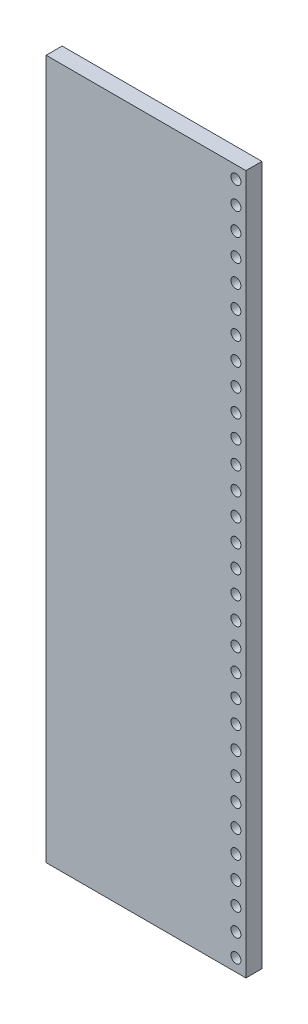
ISO-10303-21;
HEADER;
FILE_DESCRIPTION(('STEP AP214'),'2;1');
FILE_NAME('part.step','',(''),(''),'','','');
FILE_SCHEMA(('AUTOMOTIVE_DESIGN { 1 0 10303 214 1 1 1 1 }'));
ENDSEC;
DATA;
#1=APPLICATION_CONTEXT('core data for automotive mechanical design processes');
#2=APPLICATION_PROTOCOL_DEFINITION('international standard','automotive_design',2000,#1);
#3=PRODUCT_CONTEXT('',#1,'mechanical');
#4=PRODUCT('Part','Part','',(#3));
#5=PRODUCT_RELATED_PRODUCT_CATEGORY('part','',(#4));
#6=PRODUCT_DEFINITION_FORMATION('','',#4);
#7=PRODUCT_DEFINITION_CONTEXT('part definition',#1,'design');
#8=PRODUCT_DEFINITION('design','',#6,#7);
#9=PRODUCT_DEFINITION_SHAPE('','',#8);
#10=(LENGTH_UNIT() NAMED_UNIT(*) SI_UNIT(.MILLI.,.METRE.));
#11=(NAMED_UNIT(*) PLANE_ANGLE_UNIT() SI_UNIT($,.RADIAN.));
#12=(NAMED_UNIT(*) SI_UNIT($,.STERADIAN.) SOLID_ANGLE_UNIT());
#13=UNCERTAINTY_MEASURE_WITH_UNIT(LENGTH_MEASURE(1.E-05),#10,'distance_accuracy_value','');
#14=(GEOMETRIC_REPRESENTATION_CONTEXT(3) GLOBAL_UNCERTAINTY_ASSIGNED_CONTEXT((#13)) GLOBAL_UNIT_ASSIGNED_CONTEXT((#10,
#11,#12)) REPRESENTATION_CONTEXT('',''));
#15=CARTESIAN_POINT('',(0.,0.,0.));
#16=DIRECTION('',(0.,0.,1.));
#17=DIRECTION('',(1.,0.,0.));
#18=AXIS2_PLACEMENT_3D('',#15,#16,#17);
#19=CARTESIAN_POINT('',(90.,687.5,0.));
#20=DIRECTION('',(0.,0.,1.));
#21=DIRECTION('',(1.,0.,0.));
#22=AXIS2_PLACEMENT_3D('',#19,#20,#21);
#23=CYLINDRICAL_SURFACE('',#22,5.);
#24=CARTESIAN_POINT('',(90.,687.5,0.));
#25=DIRECTION('',(0.,0.,-1.));
#26=DIRECTION('',(-1.,0.,0.));
#27=AXIS2_PLACEMENT_3D('',#24,#25,#26);
#28=CIRCLE('',#27,5.);
#29=CARTESIAN_POINT('',(85.,687.5,0.));
#30=VERTEX_POINT('',#29);
#31=EDGE_CURVE('E49',#30,#30,#28,.T.);
#32=ORIENTED_EDGE('',*,*,#31,.T.);
#33=EDGE_LOOP('',(#32));
#34=FACE_BOUND('',#33,.T.);
#35=CARTESIAN_POINT('',(90.,687.5,16.));
#36=DIRECTION('',(0.,0.,-1.));
#37=DIRECTION('',(-1.,0.,0.));
#38=AXIS2_PLACEMENT_3D('',#35,#36,#37);
#39=CIRCLE('',#38,5.);
#40=CARTESIAN_POINT('',(85.,687.5,16.));
#41=VERTEX_POINT('',#40);
#42=EDGE_CURVE('E11',#41,#41,#39,.T.);
#43=ORIENTED_EDGE('',*,*,#42,.F.);
#44=EDGE_LOOP('',(#43));
#45=FACE_BOUND('',#44,.T.);
#46=ADVANCED_FACE('F41',(#34,#45),#23,.F.);
#47=CARTESIAN_POINT('',(90.,665.,0.));
#48=DIRECTION('',(0.,0.,1.));
#49=DIRECTION('',(1.,0.,0.));
#50=AXIS2_PLACEMENT_3D('',#47,#48,#49);
#51=CYLINDRICAL_SURFACE('',#50,5.);
#52=CARTESIAN_POINT('',(90.,665.,0.));
#53=DIRECTION('',(0.,0.,-1.));
#54=DIRECTION('',(-1.,0.,0.));
#55=AXIS2_PLACEMENT_3D('',#52,#53,#54);
#56=CIRCLE('',#55,5.);
#57=CARTESIAN_POINT('',(85.,665.,0.));
#58=VERTEX_POINT('',#57);
#59=EDGE_CURVE('E284',#58,#58,#56,.T.);
#60=ORIENTED_EDGE('',*,*,#59,.T.);
#61=EDGE_LOOP('',(#60));
#62=FACE_BOUND('',#61,.T.);
#63=CARTESIAN_POINT('',(90.,665.,16.));
#64=DIRECTION('',(0.,0.,-1.));
#65=DIRECTION('',(-1.,0.,0.));
#66=AXIS2_PLACEMENT_3D('',#63,#64,#65);
#67=CIRCLE('',#66,5.);
#68=CARTESIAN_POINT('',(85.,665.,16.));
#69=VERTEX_POINT('',#68);
#70=EDGE_CURVE('E287',#69,#69,#67,.T.);
#71=ORIENTED_EDGE('',*,*,#70,.F.);
#72=EDGE_LOOP('',(#71));
#73=FACE_BOUND('',#72,.T.);
#74=ADVANCED_FACE('F313',(#62,#73),#51,.F.);
#75=CARTESIAN_POINT('',(90.,642.5,0.));
#76=DIRECTION('',(0.,0.,1.));
#77=DIRECTION('',(1.,0.,0.));
#78=AXIS2_PLACEMENT_3D('',#75,#76,#77);
#79=CYLINDRICAL_SURFACE('',#78,5.);
#80=CARTESIAN_POINT('',(90.,642.5,0.));
#81=DIRECTION('',(0.,0.,-1.));
#82=DIRECTION('',(-1.,0.,0.));
#83=AXIS2_PLACEMENT_3D('',#80,#81,#82);
#84=CIRCLE('',#83,5.);
#85=CARTESIAN_POINT('',(85.,642.5,0.));
#86=VERTEX_POINT('',#85);
#87=EDGE_CURVE('E278',#86,#86,#84,.T.);
#88=ORIENTED_EDGE('',*,*,#87,.T.);
#89=EDGE_LOOP('',(#88));
#90=FACE_BOUND('',#89,.T.);
#91=CARTESIAN_POINT('',(90.,642.5,16.));
#92=DIRECTION('',(0.,0.,-1.));
#93=DIRECTION('',(-1.,0.,0.));
#94=AXIS2_PLACEMENT_3D('',#91,#92,#93);
#95=CIRCLE('',#94,5.);
#96=CARTESIAN_POINT('',(85.,642.5,16.));
#97=VERTEX_POINT('',#96);
#98=EDGE_CURVE('E281',#97,#97,#95,.T.);
#99=ORIENTED_EDGE('',*,*,#98,.F.);
#100=EDGE_LOOP('',(#99));
#101=FACE_BOUND('',#100,.T.);
#102=ADVANCED_FACE('F318',(#90,#101),#79,.F.);
#103=CARTESIAN_POINT('',(90.,620.,0.));
#104=DIRECTION('',(0.,0.,1.));
#105=DIRECTION('',(1.,0.,0.));
#106=AXIS2_PLACEMENT_3D('',#103,#104,#105);
#107=CYLINDRICAL_SURFACE('',#106,5.);
#108=CARTESIAN_POINT('',(90.,620.,0.));
#109=DIRECTION('',(0.,0.,-1.));
#110=DIRECTION('',(-1.,0.,0.));
#111=AXIS2_PLACEMENT_3D('',#108,#109,#110);
#112=CIRCLE('',#111,5.);
#113=CARTESIAN_POINT('',(85.,620.,0.));
#114=VERTEX_POINT('',#113);
#115=EDGE_CURVE('E272',#114,#114,#112,.T.);
#116=ORIENTED_EDGE('',*,*,#115,.T.);
#117=EDGE_LOOP('',(#116));
#118=FACE_BOUND('',#117,.T.);
#119=CARTESIAN_POINT('',(90.,620.,16.));
#120=DIRECTION('',(0.,0.,-1.));
#121=DIRECTION('',(-1.,0.,0.));
#122=AXIS2_PLACEMENT_3D('',#119,#120,#121);
#123=CIRCLE('',#122,5.);
#124=CARTESIAN_POINT('',(85.,620.,16.));
#125=VERTEX_POINT('',#124);
#126=EDGE_CURVE('E275',#125,#125,#123,.T.);
#127=ORIENTED_EDGE('',*,*,#126,.F.);
#128=EDGE_LOOP('',(#127));
#129=FACE_BOUND('',#128,.T.);
#130=ADVANCED_FACE('F323',(#118,#129),#107,.F.);
#131=CARTESIAN_POINT('',(90.,597.5,0.));
#132=DIRECTION('',(0.,0.,1.));
#133=DIRECTION('',(1.,0.,0.));
#134=AXIS2_PLACEMENT_3D('',#131,#132,#133);
#135=CYLINDRICAL_SURFACE('',#134,5.);
#136=CARTESIAN_POINT('',(90.,597.5,0.));
#137=DIRECTION('',(0.,0.,-1.));
#138=DIRECTION('',(-1.,0.,0.));
#139=AXIS2_PLACEMENT_3D('',#136,#137,#138);
#140=CIRCLE('',#139,5.);
#141=CARTESIAN_POINT('',(85.,597.5,0.));
#142=VERTEX_POINT('',#141);
#143=EDGE_CURVE('E266',#142,#142,#140,.T.);
#144=ORIENTED_EDGE('',*,*,#143,.T.);
#145=EDGE_LOOP('',(#144));
#146=FACE_BOUND('',#145,.T.);
#147=CARTESIAN_POINT('',(90.,597.5,16.));
#148=DIRECTION('',(0.,0.,-1.));
#149=DIRECTION('',(-1.,0.,0.));
#150=AXIS2_PLACEMENT_3D('',#147,#148,#149);
#151=CIRCLE('',#150,5.);
#152=CARTESIAN_POINT('',(85.,597.5,16.));
#153=VERTEX_POINT('',#152);
#154=EDGE_CURVE('E269',#153,#153,#151,.T.);
#155=ORIENTED_EDGE('',*,*,#154,.F.);
#156=EDGE_LOOP('',(#155));
#157=FACE_BOUND('',#156,.T.);
#158=ADVANCED_FACE('F330',(#146,#157),#135,.F.);
#159=CARTESIAN_POINT('',(90.,575.,0.));
#160=DIRECTION('',(0.,0.,1.));
#161=DIRECTION('',(1.,0.,0.));
#162=AXIS2_PLACEMENT_3D('',#159,#160,#161);
#163=CYLINDRICAL_SURFACE('',#162,5.);
#164=CARTESIAN_POINT('',(90.,575.,0.));
#165=DIRECTION('',(0.,0.,-1.));
#166=DIRECTION('',(-1.,0.,0.));
#167=AXIS2_PLACEMENT_3D('',#164,#165,#166);
#168=CIRCLE('',#167,5.);
#169=CARTESIAN_POINT('',(85.,575.,0.));
#170=VERTEX_POINT('',#169);
#171=EDGE_CURVE('E260',#170,#170,#168,.T.);
#172=ORIENTED_EDGE('',*,*,#171,.T.);
#173=EDGE_LOOP('',(#172));
#174=FACE_BOUND('',#173,.T.);
#175=CARTESIAN_POINT('',(90.,575.,16.));
#176=DIRECTION('',(0.,0.,-1.));
#177=DIRECTION('',(-1.,0.,0.));
#178=AXIS2_PLACEMENT_3D('',#175,#176,#177);
#179=CIRCLE('',#178,5.);
#180=CARTESIAN_POINT('',(85.,575.,16.));
#181=VERTEX_POINT('',#180);
#182=EDGE_CURVE('E263',#181,#181,#179,.T.);
#183=ORIENTED_EDGE('',*,*,#182,.F.);
#184=EDGE_LOOP('',(#183));
#185=FACE_BOUND('',#184,.T.);
#186=ADVANCED_FACE('F334',(#174,#185),#163,.F.);
#187=CARTESIAN_POINT('',(90.,552.5,0.));
#188=DIRECTION('',(0.,0.,1.));
#189=DIRECTION('',(1.,0.,0.));
#190=AXIS2_PLACEMENT_3D('',#187,#188,#189);
#191=CYLINDRICAL_SURFACE('',#190,5.);
#192=CARTESIAN_POINT('',(90.,552.5,0.));
#193=DIRECTION('',(0.,0.,-1.));
#194=DIRECTION('',(-1.,0.,0.));
#195=AXIS2_PLACEMENT_3D('',#192,#193,#194);
#196=CIRCLE('',#195,5.);
#197=CARTESIAN_POINT('',(85.,552.5,0.));
#198=VERTEX_POINT('',#197);
#199=EDGE_CURVE('E254',#198,#198,#196,.T.);
#200=ORIENTED_EDGE('',*,*,#199,.T.);
#201=EDGE_LOOP('',(#200));
#202=FACE_BOUND('',#201,.T.);
#203=CARTESIAN_POINT('',(90.,552.5,16.));
#204=DIRECTION('',(0.,0.,-1.));
#205=DIRECTION('',(-1.,0.,0.));
#206=AXIS2_PLACEMENT_3D('',#203,#204,#205);
#207=CIRCLE('',#206,5.);
#208=CARTESIAN_POINT('',(85.,552.5,16.));
#209=VERTEX_POINT('',#208);
#210=EDGE_CURVE('E257',#209,#209,#207,.T.);
#211=ORIENTED_EDGE('',*,*,#210,.F.);
#212=EDGE_LOOP('',(#211));
#213=FACE_BOUND('',#212,.T.);
#214=ADVANCED_FACE('F338',(#202,#213),#191,.F.);
#215=CARTESIAN_POINT('',(90.,530.,0.));
#216=DIRECTION('',(0.,0.,1.));
#217=DIRECTION('',(1.,0.,0.));
#218=AXIS2_PLACEMENT_3D('',#215,#216,#217);
#219=CYLINDRICAL_SURFACE('',#218,5.);
#220=CARTESIAN_POINT('',(90.,530.,0.));
#221=DIRECTION('',(0.,0.,-1.));
#222=DIRECTION('',(-1.,0.,0.));
#223=AXIS2_PLACEMENT_3D('',#220,#221,#222);
#224=CIRCLE('',#223,5.);
#225=CARTESIAN_POINT('',(85.,530.,0.));
#226=VERTEX_POINT('',#225);
#227=EDGE_CURVE('E248',#226,#226,#224,.T.);
#228=ORIENTED_EDGE('',*,*,#227,.T.);
#229=EDGE_LOOP('',(#228));
#230=FACE_BOUND('',#229,.T.);
#231=CARTESIAN_POINT('',(90.,530.,16.));
#232=DIRECTION('',(0.,0.,-1.));
#233=DIRECTION('',(-1.,0.,0.));
#234=AXIS2_PLACEMENT_3D('',#231,#232,#233);
#235=CIRCLE('',#234,5.);
#236=CARTESIAN_POINT('',(85.,530.,16.));
#237=VERTEX_POINT('',#236);
#238=EDGE_CURVE('E251',#237,#237,#235,.T.);
#239=ORIENTED_EDGE('',*,*,#238,.F.);
#240=EDGE_LOOP('',(#239));
#241=FACE_BOUND('',#240,.T.);
#242=ADVANCED_FACE('F342',(#230,#241),#219,.F.);
#243=CARTESIAN_POINT('',(90.,507.5,0.));
#244=DIRECTION('',(0.,0.,1.));
#245=DIRECTION('',(1.,0.,0.));
#246=AXIS2_PLACEMENT_3D('',#243,#244,#245);
#247=CYLINDRICAL_SURFACE('',#246,5.);
#248=CARTESIAN_POINT('',(90.,507.5,0.));
#249=DIRECTION('',(0.,0.,-1.));
#250=DIRECTION('',(-1.,0.,0.));
#251=AXIS2_PLACEMENT_3D('',#248,#249,#250);
#252=CIRCLE('',#251,5.);
#253=CARTESIAN_POINT('',(85.,507.5,0.));
#254=VERTEX_POINT('',#253);
#255=EDGE_CURVE('E242',#254,#254,#252,.T.);
#256=ORIENTED_EDGE('',*,*,#255,.T.);
#257=EDGE_LOOP('',(#256));
#258=FACE_BOUND('',#257,.T.);
#259=CARTESIAN_POINT('',(90.,507.5,16.));
#260=DIRECTION('',(0.,0.,-1.));
#261=DIRECTION('',(-1.,0.,0.));
#262=AXIS2_PLACEMENT_3D('',#259,#260,#261);
#263=CIRCLE('',#262,5.);
#264=CARTESIAN_POINT('',(85.,507.5,16.));
#265=VERTEX_POINT('',#264);
#266=EDGE_CURVE('E245',#265,#265,#263,.T.);
#267=ORIENTED_EDGE('',*,*,#266,.F.);
#268=EDGE_LOOP('',(#267));
#269=FACE_BOUND('',#268,.T.);
#270=ADVANCED_FACE('F346',(#258,#269),#247,.F.);
#271=CARTESIAN_POINT('',(90.,485.,0.));
#272=DIRECTION('',(0.,0.,1.));
#273=DIRECTION('',(1.,0.,0.));
#274=AXIS2_PLACEMENT_3D('',#271,#272,#273);
#275=CYLINDRICAL_SURFACE('',#274,5.);
#276=CARTESIAN_POINT('',(90.,485.,0.));
#277=DIRECTION('',(0.,0.,-1.));
#278=DIRECTION('',(-1.,0.,0.));
#279=AXIS2_PLACEMENT_3D('',#276,#277,#278);
#280=CIRCLE('',#279,5.);
#281=CARTESIAN_POINT('',(85.,485.,0.));
#282=VERTEX_POINT('',#281);
#283=EDGE_CURVE('E236',#282,#282,#280,.T.);
#284=ORIENTED_EDGE('',*,*,#283,.T.);
#285=EDGE_LOOP('',(#284));
#286=FACE_BOUND('',#285,.T.);
#287=CARTESIAN_POINT('',(90.,485.,16.));
#288=DIRECTION('',(0.,0.,-1.));
#289=DIRECTION('',(-1.,0.,0.));
#290=AXIS2_PLACEMENT_3D('',#287,#288,#289);
#291=CIRCLE('',#290,5.);
#292=CARTESIAN_POINT('',(85.,485.,16.));
#293=VERTEX_POINT('',#292);
#294=EDGE_CURVE('E239',#293,#293,#291,.T.);
#295=ORIENTED_EDGE('',*,*,#294,.F.);
#296=EDGE_LOOP('',(#295));
#297=FACE_BOUND('',#296,.T.);
#298=ADVANCED_FACE('F350',(#286,#297),#275,.F.);
#299=CARTESIAN_POINT('',(90.,462.5,0.));
#300=DIRECTION('',(0.,0.,1.));
#301=DIRECTION('',(1.,0.,0.));
#302=AXIS2_PLACEMENT_3D('',#299,#300,#301);
#303=CYLINDRICAL_SURFACE('',#302,5.);
#304=CARTESIAN_POINT('',(90.,462.5,0.));
#305=DIRECTION('',(0.,0.,-1.));
#306=DIRECTION('',(-1.,0.,0.));
#307=AXIS2_PLACEMENT_3D('',#304,#305,#306);
#308=CIRCLE('',#307,5.);
#309=CARTESIAN_POINT('',(85.,462.5,0.));
#310=VERTEX_POINT('',#309);
#311=EDGE_CURVE('E230',#310,#310,#308,.T.);
#312=ORIENTED_EDGE('',*,*,#311,.T.);
#313=EDGE_LOOP('',(#312));
#314=FACE_BOUND('',#313,.T.);
#315=CARTESIAN_POINT('',(90.,462.5,16.));
#316=DIRECTION('',(0.,0.,-1.));
#317=DIRECTION('',(-1.,0.,0.));
#318=AXIS2_PLACEMENT_3D('',#315,#316,#317);
#319=CIRCLE('',#318,5.);
#320=CARTESIAN_POINT('',(85.,462.5,16.));
#321=VERTEX_POINT('',#320);
#322=EDGE_CURVE('E233',#321,#321,#319,.T.);
#323=ORIENTED_EDGE('',*,*,#322,.F.);
#324=EDGE_LOOP('',(#323));
#325=FACE_BOUND('',#324,.T.);
#326=ADVANCED_FACE('F354',(#314,#325),#303,.F.);
#327=CARTESIAN_POINT('',(90.,440.,0.));
#328=DIRECTION('',(0.,0.,1.));
#329=DIRECTION('',(1.,0.,0.));
#330=AXIS2_PLACEMENT_3D('',#327,#328,#329);
#331=CYLINDRICAL_SURFACE('',#330,5.);
#332=CARTESIAN_POINT('',(90.,440.,0.));
#333=DIRECTION('',(0.,0.,-1.));
#334=DIRECTION('',(-1.,0.,0.));
#335=AXIS2_PLACEMENT_3D('',#332,#333,#334);
#336=CIRCLE('',#335,5.);
#337=CARTESIAN_POINT('',(85.,440.,0.));
#338=VERTEX_POINT('',#337);
#339=EDGE_CURVE('E224',#338,#338,#336,.T.);
#340=ORIENTED_EDGE('',*,*,#339,.T.);
#341=EDGE_LOOP('',(#340));
#342=FACE_BOUND('',#341,.T.);
#343=CARTESIAN_POINT('',(90.,440.,16.));
#344=DIRECTION('',(0.,0.,-1.));
#345=DIRECTION('',(-1.,0.,0.));
#346=AXIS2_PLACEMENT_3D('',#343,#344,#345);
#347=CIRCLE('',#346,5.);
#348=CARTESIAN_POINT('',(85.,440.,16.));
#349=VERTEX_POINT('',#348);
#350=EDGE_CURVE('E227',#349,#349,#347,.T.);
#351=ORIENTED_EDGE('',*,*,#350,.F.);
#352=EDGE_LOOP('',(#351));
#353=FACE_BOUND('',#352,.T.);
#354=ADVANCED_FACE('F358',(#342,#353),#331,.F.);
#355=CARTESIAN_POINT('',(90.,417.5,0.));
#356=DIRECTION('',(0.,0.,1.));
#357=DIRECTION('',(1.,0.,0.));
#358=AXIS2_PLACEMENT_3D('',#355,#356,#357);
#359=CYLINDRICAL_SURFACE('',#358,5.);
#360=CARTESIAN_POINT('',(90.,417.5,0.));
#361=DIRECTION('',(0.,0.,-1.));
#362=DIRECTION('',(-1.,0.,0.));
#363=AXIS2_PLACEMENT_3D('',#360,#361,#362);
#364=CIRCLE('',#363,5.);
#365=CARTESIAN_POINT('',(85.,417.5,0.));
#366=VERTEX_POINT('',#365);
#367=EDGE_CURVE('E218',#366,#366,#364,.T.);
#368=ORIENTED_EDGE('',*,*,#367,.T.);
#369=EDGE_LOOP('',(#368));
#370=FACE_BOUND('',#369,.T.);
#371=CARTESIAN_POINT('',(90.,417.5,16.));
#372=DIRECTION('',(0.,0.,-1.));
#373=DIRECTION('',(-1.,0.,0.));
#374=AXIS2_PLACEMENT_3D('',#371,#372,#373);
#375=CIRCLE('',#374,5.);
#376=CARTESIAN_POINT('',(85.,417.5,16.));
#377=VERTEX_POINT('',#376);
#378=EDGE_CURVE('E221',#377,#377,#375,.T.);
#379=ORIENTED_EDGE('',*,*,#378,.F.);
#380=EDGE_LOOP('',(#379));
#381=FACE_BOUND('',#380,.T.);
#382=ADVANCED_FACE('F362',(#370,#381),#359,.F.);
#383=CARTESIAN_POINT('',(90.,395.,0.));
#384=DIRECTION('',(0.,0.,1.));
#385=DIRECTION('',(1.,0.,0.));
#386=AXIS2_PLACEMENT_3D('',#383,#384,#385);
#387=CYLINDRICAL_SURFACE('',#386,5.);
#388=CARTESIAN_POINT('',(90.,395.,0.));
#389=DIRECTION('',(0.,0.,-1.));
#390=DIRECTION('',(-1.,0.,0.));
#391=AXIS2_PLACEMENT_3D('',#388,#389,#390);
#392=CIRCLE('',#391,5.);
#393=CARTESIAN_POINT('',(85.,395.,0.));
#394=VERTEX_POINT('',#393);
#395=EDGE_CURVE('E212',#394,#394,#392,.T.);
#396=ORIENTED_EDGE('',*,*,#395,.T.);
#397=EDGE_LOOP('',(#396));
#398=FACE_BOUND('',#397,.T.);
#399=CARTESIAN_POINT('',(90.,395.,16.));
#400=DIRECTION('',(0.,0.,-1.));
#401=DIRECTION('',(-1.,0.,0.));
#402=AXIS2_PLACEMENT_3D('',#399,#400,#401);
#403=CIRCLE('',#402,5.);
#404=CARTESIAN_POINT('',(85.,395.,16.));
#405=VERTEX_POINT('',#404);
#406=EDGE_CURVE('E215',#405,#405,#403,.T.);
#407=ORIENTED_EDGE('',*,*,#406,.F.);
#408=EDGE_LOOP('',(#407));
#409=FACE_BOUND('',#408,.T.);
#410=ADVANCED_FACE('F366',(#398,#409),#387,.F.);
#411=CARTESIAN_POINT('',(90.,372.5,0.));
#412=DIRECTION('',(0.,0.,1.));
#413=DIRECTION('',(1.,0.,0.));
#414=AXIS2_PLACEMENT_3D('',#411,#412,#413);
#415=CYLINDRICAL_SURFACE('',#414,5.);
#416=CARTESIAN_POINT('',(90.,372.5,0.));
#417=DIRECTION('',(0.,0.,-1.));
#418=DIRECTION('',(-1.,0.,0.));
#419=AXIS2_PLACEMENT_3D('',#416,#417,#418);
#420=CIRCLE('',#419,5.);
#421=CARTESIAN_POINT('',(85.,372.5,0.));
#422=VERTEX_POINT('',#421);
#423=EDGE_CURVE('E206',#422,#422,#420,.T.);
#424=ORIENTED_EDGE('',*,*,#423,.T.);
#425=EDGE_LOOP('',(#424));
#426=FACE_BOUND('',#425,.T.);
#427=CARTESIAN_POINT('',(90.,372.5,16.));
#428=DIRECTION('',(0.,0.,-1.));
#429=DIRECTION('',(-1.,0.,0.));
#430=AXIS2_PLACEMENT_3D('',#427,#428,#429);
#431=CIRCLE('',#430,5.);
#432=CARTESIAN_POINT('',(85.,372.5,16.));
#433=VERTEX_POINT('',#432);
#434=EDGE_CURVE('E209',#433,#433,#431,.T.);
#435=ORIENTED_EDGE('',*,*,#434,.F.);
#436=EDGE_LOOP('',(#435));
#437=FACE_BOUND('',#436,.T.);
#438=ADVANCED_FACE('F370',(#426,#437),#415,.F.);
#439=CARTESIAN_POINT('',(90.,350.,0.));
#440=DIRECTION('',(0.,0.,1.));
#441=DIRECTION('',(1.,0.,0.));
#442=AXIS2_PLACEMENT_3D('',#439,#440,#441);
#443=CYLINDRICAL_SURFACE('',#442,5.);
#444=CARTESIAN_POINT('',(90.,350.,0.));
#445=DIRECTION('',(0.,0.,-1.));
#446=DIRECTION('',(-1.,0.,0.));
#447=AXIS2_PLACEMENT_3D('',#444,#445,#446);
#448=CIRCLE('',#447,5.);
#449=CARTESIAN_POINT('',(85.,350.,0.));
#450=VERTEX_POINT('',#449);
#451=EDGE_CURVE('E200',#450,#450,#448,.T.);
#452=ORIENTED_EDGE('',*,*,#451,.T.);
#453=EDGE_LOOP('',(#452));
#454=FACE_BOUND('',#453,.T.);
#455=CARTESIAN_POINT('',(90.,350.,16.));
#456=DIRECTION('',(0.,0.,-1.));
#457=DIRECTION('',(-1.,0.,0.));
#458=AXIS2_PLACEMENT_3D('',#455,#456,#457);
#459=CIRCLE('',#458,5.);
#460=CARTESIAN_POINT('',(85.,350.,16.));
#461=VERTEX_POINT('',#460);
#462=EDGE_CURVE('E203',#461,#461,#459,.T.);
#463=ORIENTED_EDGE('',*,*,#462,.F.);
#464=EDGE_LOOP('',(#463));
#465=FACE_BOUND('',#464,.T.);
#466=ADVANCED_FACE('F374',(#454,#465),#443,.F.);
#467=CARTESIAN_POINT('',(90.,327.5,0.));
#468=DIRECTION('',(0.,0.,1.));
#469=DIRECTION('',(1.,0.,0.));
#470=AXIS2_PLACEMENT_3D('',#467,#468,#469);
#471=CYLINDRICAL_SURFACE('',#470,5.);
#472=CARTESIAN_POINT('',(90.,327.5,0.));
#473=DIRECTION('',(0.,0.,-1.));
#474=DIRECTION('',(-1.,0.,0.));
#475=AXIS2_PLACEMENT_3D('',#472,#473,#474);
#476=CIRCLE('',#475,5.);
#477=CARTESIAN_POINT('',(85.,327.5,0.));
#478=VERTEX_POINT('',#477);
#479=EDGE_CURVE('E194',#478,#478,#476,.T.);
#480=ORIENTED_EDGE('',*,*,#479,.T.);
#481=EDGE_LOOP('',(#480));
#482=FACE_BOUND('',#481,.T.);
#483=CARTESIAN_POINT('',(90.,327.5,16.));
#484=DIRECTION('',(0.,0.,-1.));
#485=DIRECTION('',(-1.,0.,0.));
#486=AXIS2_PLACEMENT_3D('',#483,#484,#485);
#487=CIRCLE('',#486,5.);
#488=CARTESIAN_POINT('',(85.,327.5,16.));
#489=VERTEX_POINT('',#488);
#490=EDGE_CURVE('E197',#489,#489,#487,.T.);
#491=ORIENTED_EDGE('',*,*,#490,.F.);
#492=EDGE_LOOP('',(#491));
#493=FACE_BOUND('',#492,.T.);
#494=ADVANCED_FACE('F378',(#482,#493),#471,.F.);
#495=CARTESIAN_POINT('',(90.,305.,0.));
#496=DIRECTION('',(0.,0.,1.));
#497=DIRECTION('',(1.,0.,0.));
#498=AXIS2_PLACEMENT_3D('',#495,#496,#497);
#499=CYLINDRICAL_SURFACE('',#498,5.);
#500=CARTESIAN_POINT('',(90.,305.,0.));
#501=DIRECTION('',(0.,0.,-1.));
#502=DIRECTION('',(-1.,0.,0.));
#503=AXIS2_PLACEMENT_3D('',#500,#501,#502);
#504=CIRCLE('',#503,5.);
#505=CARTESIAN_POINT('',(85.,305.,0.));
#506=VERTEX_POINT('',#505);
#507=EDGE_CURVE('E188',#506,#506,#504,.T.);
#508=ORIENTED_EDGE('',*,*,#507,.T.);
#509=EDGE_LOOP('',(#508));
#510=FACE_BOUND('',#509,.T.);
#511=CARTESIAN_POINT('',(90.,305.,16.));
#512=DIRECTION('',(0.,0.,-1.));
#513=DIRECTION('',(-1.,0.,0.));
#514=AXIS2_PLACEMENT_3D('',#511,#512,#513);
#515=CIRCLE('',#514,5.);
#516=CARTESIAN_POINT('',(85.,305.,16.));
#517=VERTEX_POINT('',#516);
#518=EDGE_CURVE('E191',#517,#517,#515,.T.);
#519=ORIENTED_EDGE('',*,*,#518,.F.);
#520=EDGE_LOOP('',(#519));
#521=FACE_BOUND('',#520,.T.);
#522=ADVANCED_FACE('F382',(#510,#521),#499,.F.);
#523=CARTESIAN_POINT('',(90.,282.5,0.));
#524=DIRECTION('',(0.,0.,1.));
#525=DIRECTION('',(1.,0.,0.));
#526=AXIS2_PLACEMENT_3D('',#523,#524,#525);
#527=CYLINDRICAL_SURFACE('',#526,5.);
#528=CARTESIAN_POINT('',(90.,282.5,0.));
#529=DIRECTION('',(0.,0.,-1.));
#530=DIRECTION('',(-1.,0.,0.));
#531=AXIS2_PLACEMENT_3D('',#528,#529,#530);
#532=CIRCLE('',#531,5.);
#533=CARTESIAN_POINT('',(85.,282.5,0.));
#534=VERTEX_POINT('',#533);
#535=EDGE_CURVE('E182',#534,#534,#532,.T.);
#536=ORIENTED_EDGE('',*,*,#535,.T.);
#537=EDGE_LOOP('',(#536));
#538=FACE_BOUND('',#537,.T.);
#539=CARTESIAN_POINT('',(90.,282.5,16.));
#540=DIRECTION('',(0.,0.,-1.));
#541=DIRECTION('',(-1.,0.,0.));
#542=AXIS2_PLACEMENT_3D('',#539,#540,#541);
#543=CIRCLE('',#542,5.);
#544=CARTESIAN_POINT('',(85.,282.5,16.));
#545=VERTEX_POINT('',#544);
#546=EDGE_CURVE('E185',#545,#545,#543,.T.);
#547=ORIENTED_EDGE('',*,*,#546,.F.);
#548=EDGE_LOOP('',(#547));
#549=FACE_BOUND('',#548,.T.);
#550=ADVANCED_FACE('F386',(#538,#549),#527,.F.);
#551=CARTESIAN_POINT('',(90.,260.,0.));
#552=DIRECTION('',(0.,0.,1.));
#553=DIRECTION('',(1.,0.,0.));
#554=AXIS2_PLACEMENT_3D('',#551,#552,#553);
#555=CYLINDRICAL_SURFACE('',#554,5.);
#556=CARTESIAN_POINT('',(90.,260.,0.));
#557=DIRECTION('',(0.,0.,-1.));
#558=DIRECTION('',(-1.,0.,0.));
#559=AXIS2_PLACEMENT_3D('',#556,#557,#558);
#560=CIRCLE('',#559,5.);
#561=CARTESIAN_POINT('',(85.,260.,0.));
#562=VERTEX_POINT('',#561);
#563=EDGE_CURVE('E176',#562,#562,#560,.T.);
#564=ORIENTED_EDGE('',*,*,#563,.T.);
#565=EDGE_LOOP('',(#564));
#566=FACE_BOUND('',#565,.T.);
#567=CARTESIAN_POINT('',(90.,260.,16.));
#568=DIRECTION('',(0.,0.,-1.));
#569=DIRECTION('',(-1.,0.,0.));
#570=AXIS2_PLACEMENT_3D('',#567,#568,#569);
#571=CIRCLE('',#570,5.);
#572=CARTESIAN_POINT('',(85.,260.,16.));
#573=VERTEX_POINT('',#572);
#574=EDGE_CURVE('E179',#573,#573,#571,.T.);
#575=ORIENTED_EDGE('',*,*,#574,.F.);
#576=EDGE_LOOP('',(#575));
#577=FACE_BOUND('',#576,.T.);
#578=ADVANCED_FACE('F390',(#566,#577),#555,.F.);
#579=CARTESIAN_POINT('',(90.,237.5,0.));
#580=DIRECTION('',(0.,0.,1.));
#581=DIRECTION('',(1.,0.,0.));
#582=AXIS2_PLACEMENT_3D('',#579,#580,#581);
#583=CYLINDRICAL_SURFACE('',#582,5.);
#584=CARTESIAN_POINT('',(90.,237.5,0.));
#585=DIRECTION('',(0.,0.,-1.));
#586=DIRECTION('',(-1.,0.,0.));
#587=AXIS2_PLACEMENT_3D('',#584,#585,#586);
#588=CIRCLE('',#587,5.);
#589=CARTESIAN_POINT('',(85.,237.5,0.));
#590=VERTEX_POINT('',#589);
#591=EDGE_CURVE('E170',#590,#590,#588,.T.);
#592=ORIENTED_EDGE('',*,*,#591,.T.);
#593=EDGE_LOOP('',(#592));
#594=FACE_BOUND('',#593,.T.);
#595=CARTESIAN_POINT('',(90.,237.5,16.));
#596=DIRECTION('',(0.,0.,-1.));
#597=DIRECTION('',(-1.,0.,0.));
#598=AXIS2_PLACEMENT_3D('',#595,#596,#597);
#599=CIRCLE('',#598,5.);
#600=CARTESIAN_POINT('',(85.,237.5,16.));
#601=VERTEX_POINT('',#600);
#602=EDGE_CURVE('E173',#601,#601,#599,.T.);
#603=ORIENTED_EDGE('',*,*,#602,.F.);
#604=EDGE_LOOP('',(#603));
#605=FACE_BOUND('',#604,.T.);
#606=ADVANCED_FACE('F394',(#594,#605),#583,.F.);
#607=CARTESIAN_POINT('',(90.,215.,0.));
#608=DIRECTION('',(0.,0.,1.));
#609=DIRECTION('',(1.,0.,0.));
#610=AXIS2_PLACEMENT_3D('',#607,#608,#609);
#611=CYLINDRICAL_SURFACE('',#610,5.);
#612=CARTESIAN_POINT('',(90.,215.,0.));
#613=DIRECTION('',(0.,0.,-1.));
#614=DIRECTION('',(-1.,0.,0.));
#615=AXIS2_PLACEMENT_3D('',#612,#613,#614);
#616=CIRCLE('',#615,5.);
#617=CARTESIAN_POINT('',(85.,215.,0.));
#618=VERTEX_POINT('',#617);
#619=EDGE_CURVE('E164',#618,#618,#616,.T.);
#620=ORIENTED_EDGE('',*,*,#619,.T.);
#621=EDGE_LOOP('',(#620));
#622=FACE_BOUND('',#621,.T.);
#623=CARTESIAN_POINT('',(90.,215.,16.));
#624=DIRECTION('',(0.,0.,-1.));
#625=DIRECTION('',(-1.,0.,0.));
#626=AXIS2_PLACEMENT_3D('',#623,#624,#625);
#627=CIRCLE('',#626,5.);
#628=CARTESIAN_POINT('',(85.,215.,16.));
#629=VERTEX_POINT('',#628);
#630=EDGE_CURVE('E167',#629,#629,#627,.T.);
#631=ORIENTED_EDGE('',*,*,#630,.F.);
#632=EDGE_LOOP('',(#631));
#633=FACE_BOUND('',#632,.T.);
#634=ADVANCED_FACE('F398',(#622,#633),#611,.F.);
#635=CARTESIAN_POINT('',(90.,192.5,0.));
#636=DIRECTION('',(0.,0.,1.));
#637=DIRECTION('',(1.,0.,0.));
#638=AXIS2_PLACEMENT_3D('',#635,#636,#637);
#639=CYLINDRICAL_SURFACE('',#638,5.);
#640=CARTESIAN_POINT('',(90.,192.5,0.));
#641=DIRECTION('',(0.,0.,-1.));
#642=DIRECTION('',(-1.,0.,0.));
#643=AXIS2_PLACEMENT_3D('',#640,#641,#642);
#644=CIRCLE('',#643,5.);
#645=CARTESIAN_POINT('',(85.,192.5,0.));
#646=VERTEX_POINT('',#645);
#647=EDGE_CURVE('E158',#646,#646,#644,.T.);
#648=ORIENTED_EDGE('',*,*,#647,.T.);
#649=EDGE_LOOP('',(#648));
#650=FACE_BOUND('',#649,.T.);
#651=CARTESIAN_POINT('',(90.,192.5,16.));
#652=DIRECTION('',(0.,0.,-1.));
#653=DIRECTION('',(-1.,0.,0.));
#654=AXIS2_PLACEMENT_3D('',#651,#652,#653);
#655=CIRCLE('',#654,5.);
#656=CARTESIAN_POINT('',(85.,192.5,16.));
#657=VERTEX_POINT('',#656);
#658=EDGE_CURVE('E161',#657,#657,#655,.T.);
#659=ORIENTED_EDGE('',*,*,#658,.F.);
#660=EDGE_LOOP('',(#659));
#661=FACE_BOUND('',#660,.T.);
#662=ADVANCED_FACE('F402',(#650,#661),#639,.F.);
#663=CARTESIAN_POINT('',(90.,170.,0.));
#664=DIRECTION('',(0.,0.,1.));
#665=DIRECTION('',(1.,0.,0.));
#666=AXIS2_PLACEMENT_3D('',#663,#664,#665);
#667=CYLINDRICAL_SURFACE('',#666,5.);
#668=CARTESIAN_POINT('',(90.,170.,0.));
#669=DIRECTION('',(0.,0.,-1.));
#670=DIRECTION('',(-1.,0.,0.));
#671=AXIS2_PLACEMENT_3D('',#668,#669,#670);
#672=CIRCLE('',#671,5.);
#673=CARTESIAN_POINT('',(85.,170.,0.));
#674=VERTEX_POINT('',#673);
#675=EDGE_CURVE('E152',#674,#674,#672,.T.);
#676=ORIENTED_EDGE('',*,*,#675,.T.);
#677=EDGE_LOOP('',(#676));
#678=FACE_BOUND('',#677,.T.);
#679=CARTESIAN_POINT('',(90.,170.,16.));
#680=DIRECTION('',(0.,0.,-1.));
#681=DIRECTION('',(-1.,0.,0.));
#682=AXIS2_PLACEMENT_3D('',#679,#680,#681);
#683=CIRCLE('',#682,5.);
#684=CARTESIAN_POINT('',(85.,170.,16.));
#685=VERTEX_POINT('',#684);
#686=EDGE_CURVE('E155',#685,#685,#683,.T.);
#687=ORIENTED_EDGE('',*,*,#686,.F.);
#688=EDGE_LOOP('',(#687));
#689=FACE_BOUND('',#688,.T.);
#690=ADVANCED_FACE('F406',(#678,#689),#667,.F.);
#691=CARTESIAN_POINT('',(90.,147.5,0.));
#692=DIRECTION('',(0.,0.,1.));
#693=DIRECTION('',(1.,0.,0.));
#694=AXIS2_PLACEMENT_3D('',#691,#692,#693);
#695=CYLINDRICAL_SURFACE('',#694,5.);
#696=CARTESIAN_POINT('',(90.,147.5,0.));
#697=DIRECTION('',(0.,0.,-1.));
#698=DIRECTION('',(-1.,0.,0.));
#699=AXIS2_PLACEMENT_3D('',#696,#697,#698);
#700=CIRCLE('',#699,5.);
#701=CARTESIAN_POINT('',(85.,147.5,0.));
#702=VERTEX_POINT('',#701);
#703=EDGE_CURVE('E146',#702,#702,#700,.T.);
#704=ORIENTED_EDGE('',*,*,#703,.T.);
#705=EDGE_LOOP('',(#704));
#706=FACE_BOUND('',#705,.T.);
#707=CARTESIAN_POINT('',(90.,147.5,16.));
#708=DIRECTION('',(0.,0.,-1.));
#709=DIRECTION('',(-1.,0.,0.));
#710=AXIS2_PLACEMENT_3D('',#707,#708,#709);
#711=CIRCLE('',#710,5.);
#712=CARTESIAN_POINT('',(85.,147.5,16.));
#713=VERTEX_POINT('',#712);
#714=EDGE_CURVE('E149',#713,#713,#711,.T.);
#715=ORIENTED_EDGE('',*,*,#714,.F.);
#716=EDGE_LOOP('',(#715));
#717=FACE_BOUND('',#716,.T.);
#718=ADVANCED_FACE('F410',(#706,#717),#695,.F.);
#719=CARTESIAN_POINT('',(90.,125.,0.));
#720=DIRECTION('',(0.,0.,1.));
#721=DIRECTION('',(1.,0.,0.));
#722=AXIS2_PLACEMENT_3D('',#719,#720,#721);
#723=CYLINDRICAL_SURFACE('',#722,5.);
#724=CARTESIAN_POINT('',(90.,125.,0.));
#725=DIRECTION('',(0.,0.,-1.));
#726=DIRECTION('',(-1.,0.,0.));
#727=AXIS2_PLACEMENT_3D('',#724,#725,#726);
#728=CIRCLE('',#727,5.);
#729=CARTESIAN_POINT('',(85.,125.,0.));
#730=VERTEX_POINT('',#729);
#731=EDGE_CURVE('E140',#730,#730,#728,.T.);
#732=ORIENTED_EDGE('',*,*,#731,.T.);
#733=EDGE_LOOP('',(#732));
#734=FACE_BOUND('',#733,.T.);
#735=CARTESIAN_POINT('',(90.,125.,16.));
#736=DIRECTION('',(0.,0.,-1.));
#737=DIRECTION('',(-1.,0.,0.));
#738=AXIS2_PLACEMENT_3D('',#735,#736,#737);
#739=CIRCLE('',#738,5.);
#740=CARTESIAN_POINT('',(85.,125.,16.));
#741=VERTEX_POINT('',#740);
#742=EDGE_CURVE('E143',#741,#741,#739,.T.);
#743=ORIENTED_EDGE('',*,*,#742,.F.);
#744=EDGE_LOOP('',(#743));
#745=FACE_BOUND('',#744,.T.);
#746=ADVANCED_FACE('F414',(#734,#745),#723,.F.);
#747=CARTESIAN_POINT('',(90.,102.5,0.));
#748=DIRECTION('',(0.,0.,1.));
#749=DIRECTION('',(1.,0.,0.));
#750=AXIS2_PLACEMENT_3D('',#747,#748,#749);
#751=CYLINDRICAL_SURFACE('',#750,5.);
#752=CARTESIAN_POINT('',(90.,102.5,0.));
#753=DIRECTION('',(0.,0.,-1.));
#754=DIRECTION('',(-1.,0.,0.));
#755=AXIS2_PLACEMENT_3D('',#752,#753,#754);
#756=CIRCLE('',#755,5.);
#757=CARTESIAN_POINT('',(85.,102.5,0.));
#758=VERTEX_POINT('',#757);
#759=EDGE_CURVE('E134',#758,#758,#756,.T.);
#760=ORIENTED_EDGE('',*,*,#759,.T.);
#761=EDGE_LOOP('',(#760));
#762=FACE_BOUND('',#761,.T.);
#763=CARTESIAN_POINT('',(90.,102.5,16.));
#764=DIRECTION('',(0.,0.,-1.));
#765=DIRECTION('',(-1.,0.,0.));
#766=AXIS2_PLACEMENT_3D('',#763,#764,#765);
#767=CIRCLE('',#766,5.);
#768=CARTESIAN_POINT('',(85.,102.5,16.));
#769=VERTEX_POINT('',#768);
#770=EDGE_CURVE('E137',#769,#769,#767,.T.);
#771=ORIENTED_EDGE('',*,*,#770,.F.);
#772=EDGE_LOOP('',(#771));
#773=FACE_BOUND('',#772,.T.);
#774=ADVANCED_FACE('F418',(#762,#773),#751,.F.);
#775=CARTESIAN_POINT('',(90.,80.,0.));
#776=DIRECTION('',(0.,0.,1.));
#777=DIRECTION('',(1.,0.,0.));
#778=AXIS2_PLACEMENT_3D('',#775,#776,#777);
#779=CYLINDRICAL_SURFACE('',#778,5.);
#780=CARTESIAN_POINT('',(90.,80.,0.));
#781=DIRECTION('',(0.,0.,-1.));
#782=DIRECTION('',(-1.,0.,0.));
#783=AXIS2_PLACEMENT_3D('',#780,#781,#782);
#784=CIRCLE('',#783,5.);
#785=CARTESIAN_POINT('',(85.,80.,0.));
#786=VERTEX_POINT('',#785);
#787=EDGE_CURVE('E128',#786,#786,#784,.T.);
#788=ORIENTED_EDGE('',*,*,#787,.T.);
#789=EDGE_LOOP('',(#788));
#790=FACE_BOUND('',#789,.T.);
#791=CARTESIAN_POINT('',(90.,80.,16.));
#792=DIRECTION('',(0.,0.,-1.));
#793=DIRECTION('',(-1.,0.,0.));
#794=AXIS2_PLACEMENT_3D('',#791,#792,#793);
#795=CIRCLE('',#794,5.);
#796=CARTESIAN_POINT('',(85.,80.,16.));
#797=VERTEX_POINT('',#796);
#798=EDGE_CURVE('E131',#797,#797,#795,.T.);
#799=ORIENTED_EDGE('',*,*,#798,.F.);
#800=EDGE_LOOP('',(#799));
#801=FACE_BOUND('',#800,.T.);
#802=ADVANCED_FACE('F422',(#790,#801),#779,.F.);
#803=CARTESIAN_POINT('',(90.,57.5,0.));
#804=DIRECTION('',(0.,0.,1.));
#805=DIRECTION('',(1.,0.,0.));
#806=AXIS2_PLACEMENT_3D('',#803,#804,#805);
#807=CYLINDRICAL_SURFACE('',#806,5.);
#808=CARTESIAN_POINT('',(90.,57.5,0.));
#809=DIRECTION('',(0.,0.,-1.));
#810=DIRECTION('',(-1.,0.,0.));
#811=AXIS2_PLACEMENT_3D('',#808,#809,#810);
#812=CIRCLE('',#811,5.);
#813=CARTESIAN_POINT('',(85.,57.5,0.));
#814=VERTEX_POINT('',#813);
#815=EDGE_CURVE('E122',#814,#814,#812,.T.);
#816=ORIENTED_EDGE('',*,*,#815,.T.);
#817=EDGE_LOOP('',(#816));
#818=FACE_BOUND('',#817,.T.);
#819=CARTESIAN_POINT('',(90.,57.5,16.));
#820=DIRECTION('',(0.,0.,-1.));
#821=DIRECTION('',(-1.,0.,0.));
#822=AXIS2_PLACEMENT_3D('',#819,#820,#821);
#823=CIRCLE('',#822,5.);
#824=CARTESIAN_POINT('',(85.,57.5,16.));
#825=VERTEX_POINT('',#824);
#826=EDGE_CURVE('E125',#825,#825,#823,.T.);
#827=ORIENTED_EDGE('',*,*,#826,.F.);
#828=EDGE_LOOP('',(#827));
#829=FACE_BOUND('',#828,.T.);
#830=ADVANCED_FACE('F306',(#818,#829),#807,.F.);
#831=CARTESIAN_POINT('',(0.,0.,16.));
#832=DIRECTION('',(0.,0.,-1.));
#833=DIRECTION('',(-1.,0.,0.));
#834=AXIS2_PLACEMENT_3D('',#831,#832,#833);
#835=PLANE('',#834);
#836=CARTESIAN_POINT('',(90.,35.,16.));
#837=DIRECTION('',(0.,0.,-1.));
#838=DIRECTION('',(-1.,0.,0.));
#839=AXIS2_PLACEMENT_3D('',#836,#837,#838);
#840=CIRCLE('',#839,5.);
#841=CARTESIAN_POINT('',(85.,35.,16.));
#842=VERTEX_POINT('',#841);
#843=EDGE_CURVE('E449',#842,#842,#840,.T.);
#844=ORIENTED_EDGE('',*,*,#843,.T.);
#845=EDGE_LOOP('',(#844));
#846=FACE_BOUND('',#845,.T.);
#847=DIRECTION('',(0.,-1.,0.));
#848=VECTOR('',#847,1.);
#849=CARTESIAN_POINT('',(-100.,0.,16.));
#850=LINE('',#849,#848);
#851=CARTESIAN_POINT('',(-100.,700.,16.));
#852=VERTEX_POINT('',#851);
#853=CARTESIAN_POINT('',(-100.,0.,16.));
#854=VERTEX_POINT('',#853);
#855=EDGE_CURVE('E94',#852,#854,#850,.T.);
#856=ORIENTED_EDGE('',*,*,#855,.T.);
#857=DIRECTION('',(1.,0.,0.));
#858=VECTOR('',#857,1.);
#859=CARTESIAN_POINT('',(-100.,0.,16.));
#860=LINE('',#859,#858);
#861=CARTESIAN_POINT('',(100.,0.,16.));
#862=VERTEX_POINT('',#861);
#863=EDGE_CURVE('E88',#854,#862,#860,.T.);
#864=ORIENTED_EDGE('',*,*,#863,.T.);
#865=DIRECTION('',(0.,1.,0.));
#866=VECTOR('',#865,1.);
#867=CARTESIAN_POINT('',(100.,0.,16.));
#868=LINE('',#867,#866);
#869=CARTESIAN_POINT('',(100.,700.,16.));
#870=VERTEX_POINT('',#869);
#871=EDGE_CURVE('E92',#862,#870,#868,.T.);
#872=ORIENTED_EDGE('',*,*,#871,.T.);
#873=DIRECTION('',(-1.,0.,0.));
#874=VECTOR('',#873,1.);
#875=CARTESIAN_POINT('',(-100.,700.,16.));
#876=LINE('',#875,#874);
#877=EDGE_CURVE('E57',#870,#852,#876,.T.);
#878=ORIENTED_EDGE('',*,*,#877,.T.);
#879=EDGE_LOOP('',(#856,#864,#872,#878));
#880=FACE_BOUND('',#879,.T.);
#881=CARTESIAN_POINT('',(90.,12.5,16.));
#882=DIRECTION('',(0.,0.,-1.));
#883=DIRECTION('',(-1.,0.,0.));
#884=AXIS2_PLACEMENT_3D('',#881,#882,#883);
#885=CIRCLE('',#884,5.);
#886=CARTESIAN_POINT('',(85.,12.5,16.));
#887=VERTEX_POINT('',#886);
#888=EDGE_CURVE('E112',#887,#887,#885,.T.);
#889=ORIENTED_EDGE('',*,*,#888,.T.);
#890=EDGE_LOOP('',(#889));
#891=FACE_BOUND('',#890,.T.);
#892=ORIENTED_EDGE('',*,*,#826,.T.);
#893=EDGE_LOOP('',(#892));
#894=FACE_BOUND('',#893,.T.);
#895=ORIENTED_EDGE('',*,*,#798,.T.);
#896=EDGE_LOOP('',(#895));
#897=FACE_BOUND('',#896,.T.);
#898=ORIENTED_EDGE('',*,*,#770,.T.);
#899=EDGE_LOOP('',(#898));
#900=FACE_BOUND('',#899,.T.);
#901=ORIENTED_EDGE('',*,*,#742,.T.);
#902=EDGE_LOOP('',(#901));
#903=FACE_BOUND('',#902,.T.);
#904=ORIENTED_EDGE('',*,*,#714,.T.);
#905=EDGE_LOOP('',(#904));
#906=FACE_BOUND('',#905,.T.);
#907=ORIENTED_EDGE('',*,*,#686,.T.);
#908=EDGE_LOOP('',(#907));
#909=FACE_BOUND('',#908,.T.);
#910=ORIENTED_EDGE('',*,*,#658,.T.);
#911=EDGE_LOOP('',(#910));
#912=FACE_BOUND('',#911,.T.);
#913=ORIENTED_EDGE('',*,*,#630,.T.);
#914=EDGE_LOOP('',(#913));
#915=FACE_BOUND('',#914,.T.);
#916=ORIENTED_EDGE('',*,*,#602,.T.);
#917=EDGE_LOOP('',(#916));
#918=FACE_BOUND('',#917,.T.);
#919=ORIENTED_EDGE('',*,*,#574,.T.);
#920=EDGE_LOOP('',(#919));
#921=FACE_BOUND('',#920,.T.);
#922=ORIENTED_EDGE('',*,*,#546,.T.);
#923=EDGE_LOOP('',(#922));
#924=FACE_BOUND('',#923,.T.);
#925=ORIENTED_EDGE('',*,*,#518,.T.);
#926=EDGE_LOOP('',(#925));
#927=FACE_BOUND('',#926,.T.);
#928=ORIENTED_EDGE('',*,*,#490,.T.);
#929=EDGE_LOOP('',(#928));
#930=FACE_BOUND('',#929,.T.);
#931=ORIENTED_EDGE('',*,*,#462,.T.);
#932=EDGE_LOOP('',(#931));
#933=FACE_BOUND('',#932,.T.);
#934=ORIENTED_EDGE('',*,*,#434,.T.);
#935=EDGE_LOOP('',(#934));
#936=FACE_BOUND('',#935,.T.);
#937=ORIENTED_EDGE('',*,*,#406,.T.);
#938=EDGE_LOOP('',(#937));
#939=FACE_BOUND('',#938,.T.);
#940=ORIENTED_EDGE('',*,*,#378,.T.);
#941=EDGE_LOOP('',(#940));
#942=FACE_BOUND('',#941,.T.);
#943=ORIENTED_EDGE('',*,*,#350,.T.);
#944=EDGE_LOOP('',(#943));
#945=FACE_BOUND('',#944,.T.);
#946=ORIENTED_EDGE('',*,*,#322,.T.);
#947=EDGE_LOOP('',(#946));
#948=FACE_BOUND('',#947,.T.);
#949=ORIENTED_EDGE('',*,*,#294,.T.);
#950=EDGE_LOOP('',(#949));
#951=FACE_BOUND('',#950,.T.);
#952=ORIENTED_EDGE('',*,*,#266,.T.);
#953=EDGE_LOOP('',(#952));
#954=FACE_BOUND('',#953,.T.);
#955=ORIENTED_EDGE('',*,*,#238,.T.);
#956=EDGE_LOOP('',(#955));
#957=FACE_BOUND('',#956,.T.);
#958=ORIENTED_EDGE('',*,*,#210,.T.);
#959=EDGE_LOOP('',(#958));
#960=FACE_BOUND('',#959,.T.);
#961=ORIENTED_EDGE('',*,*,#182,.T.);
#962=EDGE_LOOP('',(#961));
#963=FACE_BOUND('',#962,.T.);
#964=ORIENTED_EDGE('',*,*,#154,.T.);
#965=EDGE_LOOP('',(#964));
#966=FACE_BOUND('',#965,.T.);
#967=ORIENTED_EDGE('',*,*,#126,.T.);
#968=EDGE_LOOP('',(#967));
#969=FACE_BOUND('',#968,.T.);
#970=ORIENTED_EDGE('',*,*,#98,.T.);
#971=EDGE_LOOP('',(#970));
#972=FACE_BOUND('',#971,.T.);
#973=ORIENTED_EDGE('',*,*,#70,.T.);
#974=EDGE_LOOP('',(#973));
#975=FACE_BOUND('',#974,.T.);
#976=ORIENTED_EDGE('',*,*,#42,.T.);
#977=EDGE_LOOP('',(#976));
#978=FACE_BOUND('',#977,.T.);
#979=ADVANCED_FACE('F89',(#846,#880,#891,#894,#897,#900,#903,#906,#909,#912,#915,#918,#921,#924,
#927,#930,#933,#936,#939,#942,#945,#948,#951,#954,#957,#960,#963,#966,#969,#972,#975,#978),#835,.F.);
#980=CARTESIAN_POINT('',(0.,0.,0.));
#981=DIRECTION('',(0.,0.,-1.));
#982=DIRECTION('',(-1.,0.,0.));
#983=AXIS2_PLACEMENT_3D('',#980,#981,#982);
#984=PLANE('',#983);
#985=CARTESIAN_POINT('',(90.,35.,0.));
#986=DIRECTION('',(0.,0.,-1.));
#987=DIRECTION('',(-1.,0.,0.));
#988=AXIS2_PLACEMENT_3D('',#985,#986,#987);
#989=CIRCLE('',#988,5.);
#990=CARTESIAN_POINT('',(85.,35.,0.));
#991=VERTEX_POINT('',#990);
#992=EDGE_CURVE('E452',#991,#991,#989,.T.);
#993=ORIENTED_EDGE('',*,*,#992,.F.);
#994=EDGE_LOOP('',(#993));
#995=FACE_BOUND('',#994,.T.);
#996=DIRECTION('',(0.,-1.,0.));
#997=VECTOR('',#996,1.);
#998=CARTESIAN_POINT('',(-100.,0.,0.));
#999=LINE('',#998,#997);
#1000=CARTESIAN_POINT('',(-100.,700.,0.));
#1001=VERTEX_POINT('',#1000);
#1002=CARTESIAN_POINT('',(-100.,0.,0.));
#1003=VERTEX_POINT('',#1002);
#1004=EDGE_CURVE('E109',#1001,#1003,#999,.T.);
#1005=ORIENTED_EDGE('',*,*,#1004,.F.);
#1006=DIRECTION('',(-1.,0.,0.));
#1007=VECTOR('',#1006,1.);
#1008=CARTESIAN_POINT('',(-100.,700.,0.));
#1009=LINE('',#1008,#1007);
#1010=CARTESIAN_POINT('',(100.,700.,0.));
#1011=VERTEX_POINT('',#1010);
#1012=EDGE_CURVE('E80',#1011,#1001,#1009,.T.);
#1013=ORIENTED_EDGE('',*,*,#1012,.F.);
#1014=DIRECTION('',(0.,1.,0.));
#1015=VECTOR('',#1014,1.);
#1016=CARTESIAN_POINT('',(100.,0.,0.));
#1017=LINE('',#1016,#1015);
#1018=CARTESIAN_POINT('',(100.,0.,0.));
#1019=VERTEX_POINT('',#1018);
#1020=EDGE_CURVE('E74',#1019,#1011,#1017,.T.);
#1021=ORIENTED_EDGE('',*,*,#1020,.F.);
#1022=DIRECTION('',(1.,0.,0.));
#1023=VECTOR('',#1022,1.);
#1024=CARTESIAN_POINT('',(-100.,0.,0.));
#1025=LINE('',#1024,#1023);
#1026=EDGE_CURVE('E99',#1003,#1019,#1025,.T.);
#1027=ORIENTED_EDGE('',*,*,#1026,.F.);
#1028=EDGE_LOOP('',(#1005,#1013,#1021,#1027));
#1029=FACE_BOUND('',#1028,.T.);
#1030=CARTESIAN_POINT('',(90.,12.5,0.));
#1031=DIRECTION('',(0.,0.,-1.));
#1032=DIRECTION('',(-1.,0.,0.));
#1033=AXIS2_PLACEMENT_3D('',#1030,#1031,#1032);
#1034=CIRCLE('',#1033,5.);
#1035=CARTESIAN_POINT('',(85.,12.5,0.));
#1036=VERTEX_POINT('',#1035);
#1037=EDGE_CURVE('E119',#1036,#1036,#1034,.T.);
#1038=ORIENTED_EDGE('',*,*,#1037,.F.);
#1039=EDGE_LOOP('',(#1038));
#1040=FACE_BOUND('',#1039,.T.);
#1041=ORIENTED_EDGE('',*,*,#815,.F.);
#1042=EDGE_LOOP('',(#1041));
#1043=FACE_BOUND('',#1042,.T.);
#1044=ORIENTED_EDGE('',*,*,#787,.F.);
#1045=EDGE_LOOP('',(#1044));
#1046=FACE_BOUND('',#1045,.T.);
#1047=ORIENTED_EDGE('',*,*,#759,.F.);
#1048=EDGE_LOOP('',(#1047));
#1049=FACE_BOUND('',#1048,.T.);
#1050=ORIENTED_EDGE('',*,*,#731,.F.);
#1051=EDGE_LOOP('',(#1050));
#1052=FACE_BOUND('',#1051,.T.);
#1053=ORIENTED_EDGE('',*,*,#703,.F.);
#1054=EDGE_LOOP('',(#1053));
#1055=FACE_BOUND('',#1054,.T.);
#1056=ORIENTED_EDGE('',*,*,#675,.F.);
#1057=EDGE_LOOP('',(#1056));
#1058=FACE_BOUND('',#1057,.T.);
#1059=ORIENTED_EDGE('',*,*,#647,.F.);
#1060=EDGE_LOOP('',(#1059));
#1061=FACE_BOUND('',#1060,.T.);
#1062=ORIENTED_EDGE('',*,*,#619,.F.);
#1063=EDGE_LOOP('',(#1062));
#1064=FACE_BOUND('',#1063,.T.);
#1065=ORIENTED_EDGE('',*,*,#591,.F.);
#1066=EDGE_LOOP('',(#1065));
#1067=FACE_BOUND('',#1066,.T.);
#1068=ORIENTED_EDGE('',*,*,#563,.F.);
#1069=EDGE_LOOP('',(#1068));
#1070=FACE_BOUND('',#1069,.T.);
#1071=ORIENTED_EDGE('',*,*,#535,.F.);
#1072=EDGE_LOOP('',(#1071));
#1073=FACE_BOUND('',#1072,.T.);
#1074=ORIENTED_EDGE('',*,*,#507,.F.);
#1075=EDGE_LOOP('',(#1074));
#1076=FACE_BOUND('',#1075,.T.);
#1077=ORIENTED_EDGE('',*,*,#479,.F.);
#1078=EDGE_LOOP('',(#1077));
#1079=FACE_BOUND('',#1078,.T.);
#1080=ORIENTED_EDGE('',*,*,#451,.F.);
#1081=EDGE_LOOP('',(#1080));
#1082=FACE_BOUND('',#1081,.T.);
#1083=ORIENTED_EDGE('',*,*,#423,.F.);
#1084=EDGE_LOOP('',(#1083));
#1085=FACE_BOUND('',#1084,.T.);
#1086=ORIENTED_EDGE('',*,*,#395,.F.);
#1087=EDGE_LOOP('',(#1086));
#1088=FACE_BOUND('',#1087,.T.);
#1089=ORIENTED_EDGE('',*,*,#367,.F.);
#1090=EDGE_LOOP('',(#1089));
#1091=FACE_BOUND('',#1090,.T.);
#1092=ORIENTED_EDGE('',*,*,#339,.F.);
#1093=EDGE_LOOP('',(#1092));
#1094=FACE_BOUND('',#1093,.T.);
#1095=ORIENTED_EDGE('',*,*,#311,.F.);
#1096=EDGE_LOOP('',(#1095));
#1097=FACE_BOUND('',#1096,.T.);
#1098=ORIENTED_EDGE('',*,*,#283,.F.);
#1099=EDGE_LOOP('',(#1098));
#1100=FACE_BOUND('',#1099,.T.);
#1101=ORIENTED_EDGE('',*,*,#255,.F.);
#1102=EDGE_LOOP('',(#1101));
#1103=FACE_BOUND('',#1102,.T.);
#1104=ORIENTED_EDGE('',*,*,#227,.F.);
#1105=EDGE_LOOP('',(#1104));
#1106=FACE_BOUND('',#1105,.T.);
#1107=ORIENTED_EDGE('',*,*,#199,.F.);
#1108=EDGE_LOOP('',(#1107));
#1109=FACE_BOUND('',#1108,.T.);
#1110=ORIENTED_EDGE('',*,*,#171,.F.);
#1111=EDGE_LOOP('',(#1110));
#1112=FACE_BOUND('',#1111,.T.);
#1113=ORIENTED_EDGE('',*,*,#143,.F.);
#1114=EDGE_LOOP('',(#1113));
#1115=FACE_BOUND('',#1114,.T.);
#1116=ORIENTED_EDGE('',*,*,#115,.F.);
#1117=EDGE_LOOP('',(#1116));
#1118=FACE_BOUND('',#1117,.T.);
#1119=ORIENTED_EDGE('',*,*,#87,.F.);
#1120=EDGE_LOOP('',(#1119));
#1121=FACE_BOUND('',#1120,.T.);
#1122=ORIENTED_EDGE('',*,*,#59,.F.);
#1123=EDGE_LOOP('',(#1122));
#1124=FACE_BOUND('',#1123,.T.);
#1125=ORIENTED_EDGE('',*,*,#31,.F.);
#1126=EDGE_LOOP('',(#1125));
#1127=FACE_BOUND('',#1126,.T.);
#1128=ADVANCED_FACE('F294',(#995,#1029,#1040,#1043,#1046,#1049,#1052,#1055,#1058,#1061,#1064,
#1067,#1070,#1073,#1076,#1079,#1082,#1085,#1088,#1091,#1094,#1097,#1100,#1103,#1106,#1109,#1112,
#1115,#1118,#1121,#1124,#1127),#984,.T.);
#1129=CARTESIAN_POINT('',(-100.,0.,16.));
#1130=DIRECTION('',(1.,0.,0.));
#1131=DIRECTION('',(0.,1.,0.));
#1132=AXIS2_PLACEMENT_3D('',#1129,#1130,#1131);
#1133=PLANE('',#1132);
#1134=ORIENTED_EDGE('',*,*,#1004,.T.);
#1135=DIRECTION('',(0.,0.,-1.));
#1136=VECTOR('',#1135,1.);
#1137=CARTESIAN_POINT('',(-100.,0.,16.));
#1138=LINE('',#1137,#1136);
#1139=EDGE_CURVE('E100',#854,#1003,#1138,.T.);
#1140=ORIENTED_EDGE('',*,*,#1139,.F.);
#1141=ORIENTED_EDGE('',*,*,#855,.F.);
#1142=DIRECTION('',(0.,0.,-1.));
#1143=VECTOR('',#1142,1.);
#1144=CARTESIAN_POINT('',(-100.,700.,16.));
#1145=LINE('',#1144,#1143);
#1146=EDGE_CURVE('E105',#852,#1001,#1145,.T.);
#1147=ORIENTED_EDGE('',*,*,#1146,.T.);
#1148=EDGE_LOOP('',(#1134,#1140,#1141,#1147));
#1149=FACE_BOUND('',#1148,.T.);
#1150=ADVANCED_FACE('F296',(#1149),#1133,.F.);
#1151=CARTESIAN_POINT('',(-100.,0.,16.));
#1152=DIRECTION('',(0.,1.,0.));
#1153=DIRECTION('',(-1.,0.,0.));
#1154=AXIS2_PLACEMENT_3D('',#1151,#1152,#1153);
#1155=PLANE('',#1154);
#1156=ORIENTED_EDGE('',*,*,#1026,.T.);
#1157=DIRECTION('',(0.,0.,-1.));
#1158=VECTOR('',#1157,1.);
#1159=CARTESIAN_POINT('',(100.,0.,16.));
#1160=LINE('',#1159,#1158);
#1161=EDGE_CURVE('E97',#862,#1019,#1160,.T.);
#1162=ORIENTED_EDGE('',*,*,#1161,.F.);
#1163=ORIENTED_EDGE('',*,*,#863,.F.);
#1164=ORIENTED_EDGE('',*,*,#1139,.T.);
#1165=EDGE_LOOP('',(#1156,#1162,#1163,#1164));
#1166=FACE_BOUND('',#1165,.T.);
#1167=ADVANCED_FACE('F98',(#1166),#1155,.F.);
#1168=CARTESIAN_POINT('',(100.,0.,16.));
#1169=DIRECTION('',(-1.,0.,0.));
#1170=DIRECTION('',(0.,-1.,0.));
#1171=AXIS2_PLACEMENT_3D('',#1168,#1169,#1170);
#1172=PLANE('',#1171);
#1173=ORIENTED_EDGE('',*,*,#1020,.T.);
#1174=DIRECTION('',(0.,0.,-1.));
#1175=VECTOR('',#1174,1.);
#1176=CARTESIAN_POINT('',(100.,700.,16.));
#1177=LINE('',#1176,#1175);
#1178=EDGE_CURVE('E101',#870,#1011,#1177,.T.);
#1179=ORIENTED_EDGE('',*,*,#1178,.F.);
#1180=ORIENTED_EDGE('',*,*,#871,.F.);
#1181=ORIENTED_EDGE('',*,*,#1161,.T.);
#1182=EDGE_LOOP('',(#1173,#1179,#1180,#1181));
#1183=FACE_BOUND('',#1182,.T.);
#1184=ADVANCED_FACE('F103',(#1183),#1172,.F.);
#1185=CARTESIAN_POINT('',(-100.,700.,16.));
#1186=DIRECTION('',(0.,-1.,0.));
#1187=DIRECTION('',(0.,0.,-1.));
#1188=AXIS2_PLACEMENT_3D('',#1185,#1186,#1187);
#1189=PLANE('',#1188);
#1190=ORIENTED_EDGE('',*,*,#1012,.T.);
#1191=ORIENTED_EDGE('',*,*,#1146,.F.);
#1192=ORIENTED_EDGE('',*,*,#877,.F.);
#1193=ORIENTED_EDGE('',*,*,#1178,.T.);
#1194=EDGE_LOOP('',(#1190,#1191,#1192,#1193));
#1195=FACE_BOUND('',#1194,.T.);
#1196=ADVANCED_FACE('F433',(#1195),#1189,.F.);
#1197=CARTESIAN_POINT('',(90.,12.5,0.));
#1198=DIRECTION('',(0.,0.,1.));
#1199=DIRECTION('',(1.,0.,0.));
#1200=AXIS2_PLACEMENT_3D('',#1197,#1198,#1199);
#1201=CYLINDRICAL_SURFACE('',#1200,5.);
#1202=ORIENTED_EDGE('',*,*,#1037,.T.);
#1203=EDGE_LOOP('',(#1202));
#1204=FACE_BOUND('',#1203,.T.);
#1205=ORIENTED_EDGE('',*,*,#888,.F.);
#1206=EDGE_LOOP('',(#1205));
#1207=FACE_BOUND('',#1206,.T.);
#1208=ADVANCED_FACE('F435',(#1204,#1207),#1201,.F.);
#1209=CARTESIAN_POINT('',(90.,35.,0.));
#1210=DIRECTION('',(0.,0.,1.));
#1211=DIRECTION('',(1.,0.,0.));
#1212=AXIS2_PLACEMENT_3D('',#1209,#1210,#1211);
#1213=CYLINDRICAL_SURFACE('',#1212,5.);
#1214=ORIENTED_EDGE('',*,*,#992,.T.);
#1215=EDGE_LOOP('',(#1214));
#1216=FACE_BOUND('',#1215,.T.);
#1217=ORIENTED_EDGE('',*,*,#843,.F.);
#1218=EDGE_LOOP('',(#1217));
#1219=FACE_BOUND('',#1218,.T.);
#1220=ADVANCED_FACE('F438',(#1216,#1219),#1213,.F.);
#1221=CLOSED_SHELL('',(#46,#74,#102,#130,#158,#186,#214,#242,#270,#298,#326,#354,#382,#410,#438,
#466,#494,#522,#550,#578,#606,#634,#662,#690,#718,#746,#774,#802,#830,#979,#1128,#1150,#1167,
#1184,#1196,#1208,#1220));
#1222=MANIFOLD_SOLID_BREP('B2',#1221);
#1223=ADVANCED_BREP_SHAPE_REPRESENTATION('',(#18,#1222),#14);
#1224=SHAPE_DEFINITION_REPRESENTATION(#9,#1223);
ENDSEC;
END-ISO-10303-21;
